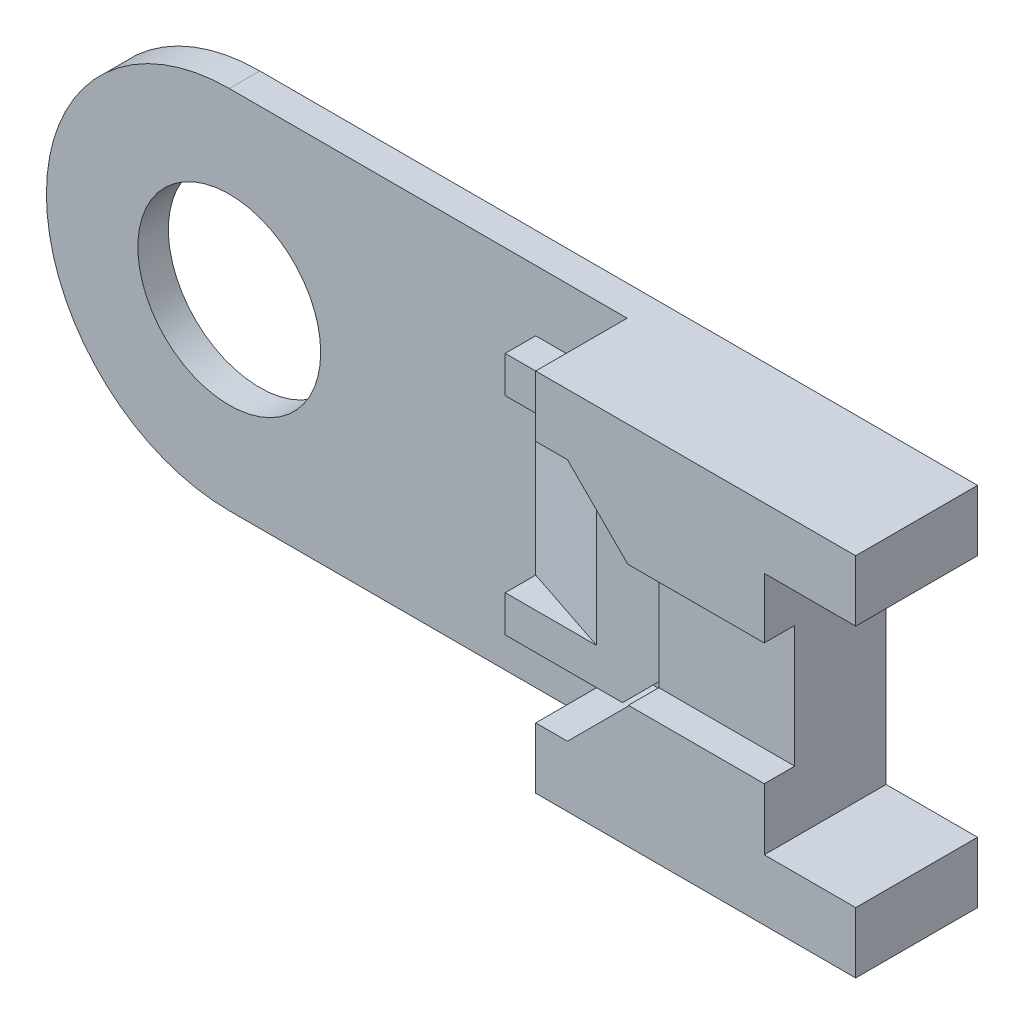
ISO-10303-21;
HEADER;
FILE_DESCRIPTION(('STEP AP214'),'2;1');
FILE_NAME('part.step','',(''),(''),'','','');
FILE_SCHEMA(('AUTOMOTIVE_DESIGN { 1 0 10303 214 1 1 1 1 }'));
ENDSEC;
DATA;
#1=APPLICATION_CONTEXT('core data for automotive mechanical design processes');
#2=APPLICATION_PROTOCOL_DEFINITION('international standard','automotive_design',2000,#1);
#3=PRODUCT_CONTEXT('',#1,'mechanical');
#4=PRODUCT('Part','Part','',(#3));
#5=PRODUCT_RELATED_PRODUCT_CATEGORY('part','',(#4));
#6=PRODUCT_DEFINITION_FORMATION('','',#4);
#7=PRODUCT_DEFINITION_CONTEXT('part definition',#1,'design');
#8=PRODUCT_DEFINITION('design','',#6,#7);
#9=PRODUCT_DEFINITION_SHAPE('','',#8);
#10=(LENGTH_UNIT() NAMED_UNIT(*) SI_UNIT(.MILLI.,.METRE.));
#11=(NAMED_UNIT(*) PLANE_ANGLE_UNIT() SI_UNIT($,.RADIAN.));
#12=(NAMED_UNIT(*) SI_UNIT($,.STERADIAN.) SOLID_ANGLE_UNIT());
#13=UNCERTAINTY_MEASURE_WITH_UNIT(LENGTH_MEASURE(1.E-05),#10,'distance_accuracy_value','');
#14=(GEOMETRIC_REPRESENTATION_CONTEXT(3) GLOBAL_UNCERTAINTY_ASSIGNED_CONTEXT((#13)) GLOBAL_UNIT_ASSIGNED_CONTEXT((#10,
#11,#12)) REPRESENTATION_CONTEXT('',''));
#15=CARTESIAN_POINT('',(0.,0.,0.));
#16=DIRECTION('',(0.,0.,1.));
#17=DIRECTION('',(1.,0.,0.));
#18=AXIS2_PLACEMENT_3D('',#15,#16,#17);
#19=CARTESIAN_POINT('',(46.2070441422371,20.,20.));
#20=DIRECTION('',(0.,1.,0.));
#21=DIRECTION('',(0.,0.,1.));
#22=AXIS2_PLACEMENT_3D('',#19,#20,#21);
#23=PLANE('',#22);
#24=DIRECTION('',(0.,0.,-1.));
#25=VECTOR('',#24,1.);
#26=CARTESIAN_POINT('',(46.2070441422371,20.,40.));
#27=LINE('',#26,#25);
#28=CARTESIAN_POINT('',(46.2070441422371,20.,20.));
#29=VERTEX_POINT('',#28);
#30=CARTESIAN_POINT('',(46.2070441422371,20.,10.));
#31=VERTEX_POINT('',#30);
#32=EDGE_CURVE('E367',#29,#31,#27,.T.);
#33=ORIENTED_EDGE('',*,*,#32,.F.);
#34=DIRECTION('',(-1.,0.,0.));
#35=VECTOR('',#34,1.);
#36=CARTESIAN_POINT('',(46.2070441422371,20.,20.));
#37=LINE('',#36,#35);
#38=CARTESIAN_POINT('',(16.2070441422371,20.,20.));
#39=VERTEX_POINT('',#38);
#40=EDGE_CURVE('E254',#29,#39,#37,.T.);
#41=ORIENTED_EDGE('',*,*,#40,.T.);
#42=DIRECTION('',(0.,0.,-1.));
#43=VECTOR('',#42,1.);
#44=CARTESIAN_POINT('',(16.2070441422371,20.,20.));
#45=LINE('',#44,#43);
#46=CARTESIAN_POINT('',(16.2070441422371,20.,10.));
#47=VERTEX_POINT('',#46);
#48=EDGE_CURVE('E235',#39,#47,#45,.T.);
#49=ORIENTED_EDGE('',*,*,#48,.T.);
#50=DIRECTION('',(1.,0.,0.));
#51=VECTOR('',#50,1.);
#52=CARTESIAN_POINT('',(46.2070441422371,20.,10.));
#53=LINE('',#52,#51);
#54=EDGE_CURVE('E301',#47,#31,#53,.T.);
#55=ORIENTED_EDGE('',*,*,#54,.T.);
#56=EDGE_LOOP('',(#33,#41,#49,#55));
#57=FACE_BOUND('',#56,.T.);
#58=ADVANCED_FACE('F39',(#57),#23,.F.);
#59=CARTESIAN_POINT('',(16.2070441422371,100.,20.));
#60=DIRECTION('',(1.,0.,0.));
#61=DIRECTION('',(0.,1.,0.));
#62=AXIS2_PLACEMENT_3D('',#59,#60,#61);
#63=PLANE('',#62);
#64=DIRECTION('',(0.,0.,-1.));
#65=VECTOR('',#64,1.);
#66=CARTESIAN_POINT('',(16.2070441422371,88.,20.));
#67=LINE('',#66,#65);
#68=CARTESIAN_POINT('',(16.2070441422371,88.,20.));
#69=VERTEX_POINT('',#68);
#70=CARTESIAN_POINT('',(16.2070441422371,88.,10.));
#71=VERTEX_POINT('',#70);
#72=EDGE_CURVE('E261',#69,#71,#67,.T.);
#73=ORIENTED_EDGE('',*,*,#72,.F.);
#74=DIRECTION('',(0.,-1.,0.));
#75=VECTOR('',#74,1.);
#76=CARTESIAN_POINT('',(16.2070441422371,100.,20.));
#77=LINE('',#76,#75);
#78=CARTESIAN_POINT('',(16.2070441422371,100.,20.));
#79=VERTEX_POINT('',#78);
#80=EDGE_CURVE('E276',#79,#69,#77,.T.);
#81=ORIENTED_EDGE('',*,*,#80,.F.);
#82=DIRECTION('',(0.,0.,-1.));
#83=VECTOR('',#82,1.);
#84=CARTESIAN_POINT('',(16.2070441422371,100.,20.));
#85=LINE('',#84,#83);
#86=CARTESIAN_POINT('',(16.2070441422371,100.,10.));
#87=VERTEX_POINT('',#86);
#88=EDGE_CURVE('E313',#79,#87,#85,.T.);
#89=ORIENTED_EDGE('',*,*,#88,.T.);
#90=DIRECTION('',(0.,-1.,0.));
#91=VECTOR('',#90,1.);
#92=CARTESIAN_POINT('',(16.2070441422371,100.,10.));
#93=LINE('',#92,#91);
#94=EDGE_CURVE('E297',#87,#71,#93,.T.);
#95=ORIENTED_EDGE('',*,*,#94,.T.);
#96=EDGE_LOOP('',(#73,#81,#89,#95));
#97=FACE_BOUND('',#96,.T.);
#98=ADVANCED_FACE('F554',(#97),#63,.F.);
#99=CARTESIAN_POINT('',(0.,0.,20.));
#100=DIRECTION('',(0.,0.,1.));
#101=DIRECTION('',(1.,0.,0.));
#102=AXIS2_PLACEMENT_3D('',#99,#100,#101);
#103=PLANE('',#102);
#104=DIRECTION('',(-1.,0.,0.));
#105=VECTOR('',#104,1.);
#106=CARTESIAN_POINT('',(46.2070441422371,88.,20.));
#107=LINE('',#106,#105);
#108=CARTESIAN_POINT('',(46.2070441422371,88.,20.));
#109=VERTEX_POINT('',#108);
#110=EDGE_CURVE('E241',#109,#69,#107,.T.);
#111=ORIENTED_EDGE('',*,*,#110,.F.);
#112=DIRECTION('',(0.,-1.,0.));
#113=VECTOR('',#112,1.);
#114=CARTESIAN_POINT('',(46.2070441422371,0.,20.));
#115=LINE('',#114,#113);
#116=CARTESIAN_POINT('',(46.2070441422371,32.,20.));
#117=VERTEX_POINT('',#116);
#118=EDGE_CURVE('E48',#109,#117,#115,.T.);
#119=ORIENTED_EDGE('',*,*,#118,.T.);
#120=DIRECTION('',(-1.,0.,0.));
#121=VECTOR('',#120,1.);
#122=CARTESIAN_POINT('',(46.2070441422371,32.,20.));
#123=LINE('',#122,#121);
#124=CARTESIAN_POINT('',(16.2070441422371,32.,20.));
#125=VERTEX_POINT('',#124);
#126=EDGE_CURVE('E246',#117,#125,#123,.T.);
#127=ORIENTED_EDGE('',*,*,#126,.T.);
#128=DIRECTION('',(0.,-1.,0.));
#129=VECTOR('',#128,1.);
#130=CARTESIAN_POINT('',(16.2070441422371,32.,20.));
#131=LINE('',#130,#129);
#132=EDGE_CURVE('E229',#125,#39,#131,.T.);
#133=ORIENTED_EDGE('',*,*,#132,.T.);
#134=ORIENTED_EDGE('',*,*,#40,.F.);
#135=DIRECTION('',(1.,0.,0.));
#136=VECTOR('',#135,1.);
#137=CARTESIAN_POINT('',(16.2070441422371,20.,20.));
#138=LINE('',#137,#136);
#139=CARTESIAN_POINT('',(54.6934302699853,20.,20.));
#140=VERTEX_POINT('',#139);
#141=EDGE_CURVE('E281',#29,#140,#138,.T.);
#142=ORIENTED_EDGE('',*,*,#141,.T.);
#143=DIRECTION('',(0.707106781186548,0.707106781186548,0.));
#144=VECTOR('',#143,1.);
#145=CARTESIAN_POINT('',(54.6934302699853,20.,20.));
#146=LINE('',#145,#144);
#147=CARTESIAN_POINT('',(76.6336353854819,41.9402051154966,20.));
#148=VERTEX_POINT('',#147);
#149=EDGE_CURVE('E284',#140,#148,#146,.T.);
#150=ORIENTED_EDGE('',*,*,#149,.T.);
#151=DIRECTION('',(0.,1.,0.));
#152=VECTOR('',#151,1.);
#153=CARTESIAN_POINT('',(76.6336353854819,41.9402051154966,20.));
#154=LINE('',#153,#152);
#155=CARTESIAN_POINT('',(76.6336353854819,80.,20.));
#156=VERTEX_POINT('',#155);
#157=EDGE_CURVE('E288',#148,#156,#154,.T.);
#158=ORIENTED_EDGE('',*,*,#157,.T.);
#159=DIRECTION('',(-0.707106781186547,0.707106781186548,0.));
#160=VECTOR('',#159,1.);
#161=CARTESIAN_POINT('',(76.6336353854819,80.,20.));
#162=LINE('',#161,#160);
#163=CARTESIAN_POINT('',(56.6336353854818,100.,20.));
#164=VERTEX_POINT('',#163);
#165=EDGE_CURVE('E291',#156,#164,#162,.T.);
#166=ORIENTED_EDGE('',*,*,#165,.T.);
#167=DIRECTION('',(-1.,0.,0.));
#168=VECTOR('',#167,1.);
#169=CARTESIAN_POINT('',(56.6336353854818,100.,20.));
#170=LINE('',#169,#168);
#171=CARTESIAN_POINT('',(46.2070441422371,100.,20.));
#172=VERTEX_POINT('',#171);
#173=EDGE_CURVE('E272',#164,#172,#170,.T.);
#174=ORIENTED_EDGE('',*,*,#173,.T.);
#175=EDGE_CURVE('E277',#172,#79,#170,.T.);
#176=ORIENTED_EDGE('',*,*,#175,.T.);
#177=ORIENTED_EDGE('',*,*,#80,.T.);
#178=EDGE_LOOP('',(#111,#119,#127,#133,#134,#142,#150,#158,#166,#174,#176,#177));
#179=FACE_BOUND('',#178,.T.);
#180=ADVANCED_FACE('F250',(#179),#103,.T.);
#181=CARTESIAN_POINT('',(-84.3434192007782,60.,10.));
#182=DIRECTION('',(0.,0.,1.));
#183=DIRECTION('',(1.,0.,0.));
#184=AXIS2_PLACEMENT_3D('',#181,#182,#183);
#185=PLANE('',#184);
#186=CARTESIAN_POINT('',(-84.3434192007782,60.,10.));
#187=DIRECTION('',(0.,0.,1.));
#188=DIRECTION('',(1.,0.,0.));
#189=AXIS2_PLACEMENT_3D('',#186,#187,#188);
#190=CIRCLE('',#189,30.);
#191=CARTESIAN_POINT('',(-54.3434192007782,60.,10.));
#192=VERTEX_POINT('',#191);
#193=EDGE_CURVE('E455',#192,#192,#190,.T.);
#194=ORIENTED_EDGE('',*,*,#193,.F.);
#195=EDGE_LOOP('',(#194));
#196=FACE_BOUND('',#195,.T.);
#197=ORIENTED_EDGE('',*,*,#94,.F.);
#198=DIRECTION('',(-1.,0.,0.));
#199=VECTOR('',#198,1.);
#200=CARTESIAN_POINT('',(46.2070441422371,100.,10.));
#201=LINE('',#200,#199);
#202=CARTESIAN_POINT('',(46.2070441422371,100.,10.));
#203=VERTEX_POINT('',#202);
#204=EDGE_CURVE('E271',#203,#87,#201,.T.);
#205=ORIENTED_EDGE('',*,*,#204,.F.);
#206=DIRECTION('',(0.,1.,0.));
#207=VECTOR('',#206,1.);
#208=CARTESIAN_POINT('',(46.2070441422371,60.,10.));
#209=LINE('',#208,#207);
#210=CARTESIAN_POINT('',(46.2070441422371,120.,10.));
#211=VERTEX_POINT('',#210);
#212=EDGE_CURVE('E449',#203,#211,#209,.T.);
#213=ORIENTED_EDGE('',*,*,#212,.T.);
#214=DIRECTION('',(-1.,0.,0.));
#215=VECTOR('',#214,1.);
#216=CARTESIAN_POINT('',(46.2070441422371,120.,10.));
#217=LINE('',#216,#215);
#218=CARTESIAN_POINT('',(-84.3434192007782,120.,10.));
#219=VERTEX_POINT('',#218);
#220=EDGE_CURVE('E467',#211,#219,#217,.T.);
#221=ORIENTED_EDGE('',*,*,#220,.T.);
#222=CARTESIAN_POINT('',(-84.3434192007782,60.,10.));
#223=DIRECTION('',(0.,0.,1.));
#224=DIRECTION('',(1.,0.,0.));
#225=AXIS2_PLACEMENT_3D('',#222,#223,#224);
#226=CIRCLE('',#225,60.);
#227=CARTESIAN_POINT('',(-84.3434192007782,0.,10.));
#228=VERTEX_POINT('',#227);
#229=EDGE_CURVE('E471',#219,#228,#226,.T.);
#230=ORIENTED_EDGE('',*,*,#229,.T.);
#231=DIRECTION('',(1.,0.,0.));
#232=VECTOR('',#231,1.);
#233=CARTESIAN_POINT('',(0.,0.,10.));
#234=LINE('',#233,#232);
#235=CARTESIAN_POINT('',(46.2070441422371,0.,10.));
#236=VERTEX_POINT('',#235);
#237=EDGE_CURVE('E463',#228,#236,#234,.T.);
#238=ORIENTED_EDGE('',*,*,#237,.T.);
#239=EDGE_CURVE('E450',#236,#31,#209,.T.);
#240=ORIENTED_EDGE('',*,*,#239,.T.);
#241=ORIENTED_EDGE('',*,*,#54,.F.);
#242=DIRECTION('',(0.,1.,0.));
#243=VECTOR('',#242,1.);
#244=CARTESIAN_POINT('',(16.2070441422371,19.,10.));
#245=LINE('',#244,#243);
#246=CARTESIAN_POINT('',(16.2070441422371,32.,10.));
#247=VERTEX_POINT('',#246);
#248=EDGE_CURVE('E268',#47,#247,#245,.T.);
#249=ORIENTED_EDGE('',*,*,#248,.T.);
#250=EDGE_CURVE('E55',#247,#71,#245,.T.);
#251=ORIENTED_EDGE('',*,*,#250,.T.);
#252=EDGE_LOOP('',(#197,#205,#213,#221,#230,#238,#240,#241,#249,#251));
#253=FACE_BOUND('',#252,.T.);
#254=ADVANCED_FACE('F546',(#196,#253),#185,.T.);
#255=DIRECTION('',(0.,1.,0.));
#256=VECTOR('',#255,1.);
#257=CARTESIAN_POINT('',(76.6336353854819,80.,10.));
#258=LINE('',#257,#256);
#259=CARTESIAN_POINT('',(76.6336353854819,40.,10.));
#260=VERTEX_POINT('',#259);
#261=CARTESIAN_POINT('',(76.6336353854819,41.9402051154966,10.));
#262=VERTEX_POINT('',#261);
#263=EDGE_CURVE('E326',#260,#262,#258,.T.);
#264=ORIENTED_EDGE('',*,*,#263,.T.);
#265=DIRECTION('',(0.707106781186548,0.707106781186548,0.));
#266=VECTOR('',#265,1.);
#267=CARTESIAN_POINT('',(54.6934302699853,20.,10.));
#268=LINE('',#267,#266);
#269=CARTESIAN_POINT('',(54.6934302699853,20.,10.));
#270=VERTEX_POINT('',#269);
#271=EDGE_CURVE('E304',#270,#262,#268,.T.);
#272=ORIENTED_EDGE('',*,*,#271,.F.);
#273=DIRECTION('',(1.,0.,0.));
#274=VECTOR('',#273,1.);
#275=CARTESIAN_POINT('',(19.5990862433128,20.,10.));
#276=LINE('',#275,#274);
#277=CARTESIAN_POINT('',(56.6336353854819,20.,10.));
#278=VERTEX_POINT('',#277);
#279=EDGE_CURVE('E318',#270,#278,#276,.T.);
#280=ORIENTED_EDGE('',*,*,#279,.T.);
#281=DIRECTION('',(0.707106781186548,0.707106781186548,0.));
#282=VECTOR('',#281,1.);
#283=CARTESIAN_POINT('',(56.6336353854819,20.,10.));
#284=LINE('',#283,#282);
#285=EDGE_CURVE('E321',#278,#260,#284,.T.);
#286=ORIENTED_EDGE('',*,*,#285,.T.);
#287=EDGE_LOOP('',(#264,#272,#280,#286));
#288=FACE_BOUND('',#287,.T.);
#289=ADVANCED_FACE('F595',(#288),#185,.T.);
#290=CARTESIAN_POINT('',(19.5990862433128,20.,10.));
#291=DIRECTION('',(0.,-1.,0.));
#292=DIRECTION('',(1.,0.,0.));
#293=AXIS2_PLACEMENT_3D('',#290,#291,#292);
#294=PLANE('',#293);
#295=DIRECTION('',(0.,0.,-1.));
#296=VECTOR('',#295,1.);
#297=CARTESIAN_POINT('',(54.6934302699853,20.,20.));
#298=LINE('',#297,#296);
#299=EDGE_CURVE('E310',#140,#270,#298,.T.);
#300=ORIENTED_EDGE('',*,*,#299,.F.);
#301=ORIENTED_EDGE('',*,*,#141,.F.);
#302=CARTESIAN_POINT('',(46.2070441422371,20.,40.));
#303=VERTEX_POINT('',#302);
#304=EDGE_CURVE('E368',#303,#29,#27,.T.);
#305=ORIENTED_EDGE('',*,*,#304,.F.);
#306=DIRECTION('',(1.,0.,0.));
#307=VECTOR('',#306,1.);
#308=CARTESIAN_POINT('',(19.5990862433128,20.,40.));
#309=LINE('',#308,#307);
#310=CARTESIAN_POINT('',(56.6336353854819,20.,40.));
#311=VERTEX_POINT('',#310);
#312=EDGE_CURVE('E317',#303,#311,#309,.T.);
#313=ORIENTED_EDGE('',*,*,#312,.T.);
#314=DIRECTION('',(0.,0.,1.));
#315=VECTOR('',#314,1.);
#316=CARTESIAN_POINT('',(56.6336353854819,20.,10.));
#317=LINE('',#316,#315);
#318=EDGE_CURVE('E330',#278,#311,#317,.T.);
#319=ORIENTED_EDGE('',*,*,#318,.F.);
#320=ORIENTED_EDGE('',*,*,#279,.F.);
#321=EDGE_LOOP('',(#300,#301,#305,#313,#319,#320));
#322=FACE_BOUND('',#321,.T.);
#323=ADVANCED_FACE('F591',(#322),#294,.F.);
#324=CARTESIAN_POINT('',(76.6336353854819,80.,10.));
#325=DIRECTION('',(1.,0.,0.));
#326=DIRECTION('',(0.,1.,0.));
#327=AXIS2_PLACEMENT_3D('',#324,#325,#326);
#328=PLANE('',#327);
#329=DIRECTION('',(0.,0.,-1.));
#330=VECTOR('',#329,1.);
#331=CARTESIAN_POINT('',(76.6336353854819,41.9402051154966,20.));
#332=LINE('',#331,#330);
#333=EDGE_CURVE('E294',#148,#262,#332,.T.);
#334=ORIENTED_EDGE('',*,*,#333,.T.);
#335=ORIENTED_EDGE('',*,*,#263,.F.);
#336=DIRECTION('',(0.,0.,1.));
#337=VECTOR('',#336,1.);
#338=CARTESIAN_POINT('',(76.6336353854819,40.,10.));
#339=LINE('',#338,#337);
#340=CARTESIAN_POINT('',(76.6336353854819,40.,40.));
#341=VERTEX_POINT('',#340);
#342=EDGE_CURVE('E354',#260,#341,#339,.T.);
#343=ORIENTED_EDGE('',*,*,#342,.T.);
#344=DIRECTION('',(0.,1.,0.));
#345=VECTOR('',#344,1.);
#346=CARTESIAN_POINT('',(76.6336353854819,80.,40.));
#347=LINE('',#346,#345);
#348=CARTESIAN_POINT('',(76.6336353854819,40.2090922157293,40.));
#349=VERTEX_POINT('',#348);
#350=EDGE_CURVE('E337',#341,#349,#347,.T.);
#351=ORIENTED_EDGE('',*,*,#350,.T.);
#352=DIRECTION('',(0.,0.,1.));
#353=VECTOR('',#352,1.);
#354=CARTESIAN_POINT('',(76.6336353854819,40.2090922157293,30.));
#355=LINE('',#354,#353);
#356=CARTESIAN_POINT('',(76.6336353854819,40.2090922157293,30.));
#357=VERTEX_POINT('',#356);
#358=EDGE_CURVE('E350',#357,#349,#355,.T.);
#359=ORIENTED_EDGE('',*,*,#358,.F.);
#360=DIRECTION('',(0.,-1.,0.));
#361=VECTOR('',#360,1.);
#362=CARTESIAN_POINT('',(76.6336353854819,0.,30.));
#363=LINE('',#362,#361);
#364=CARTESIAN_POINT('',(76.6336353854819,80.,30.));
#365=VERTEX_POINT('',#364);
#366=EDGE_CURVE('E526',#365,#357,#363,.T.);
#367=ORIENTED_EDGE('',*,*,#366,.F.);
#368=DIRECTION('',(0.,0.,1.));
#369=VECTOR('',#368,1.);
#370=CARTESIAN_POINT('',(76.6336353854819,80.,10.));
#371=LINE('',#370,#369);
#372=EDGE_CURVE('E351',#156,#365,#371,.T.);
#373=ORIENTED_EDGE('',*,*,#372,.F.);
#374=ORIENTED_EDGE('',*,*,#157,.F.);
#375=EDGE_LOOP('',(#334,#335,#343,#351,#359,#367,#373,#374));
#376=FACE_BOUND('',#375,.T.);
#377=ADVANCED_FACE('F598',(#376),#328,.F.);
#378=CARTESIAN_POINT('',(46.2070441422371,120.,40.));
#379=DIRECTION('',(1.,0.,0.));
#380=DIRECTION('',(0.,1.,0.));
#381=AXIS2_PLACEMENT_3D('',#378,#379,#380);
#382=PLANE('',#381);
#383=ORIENTED_EDGE('',*,*,#212,.F.);
#384=DIRECTION('',(0.,0.,1.));
#385=VECTOR('',#384,1.);
#386=CARTESIAN_POINT('',(46.2070441422371,100.,40.));
#387=LINE('',#386,#385);
#388=EDGE_CURVE('E372',#203,#172,#387,.T.);
#389=ORIENTED_EDGE('',*,*,#388,.T.);
#390=CARTESIAN_POINT('',(46.2070441422371,100.,40.));
#391=VERTEX_POINT('',#390);
#392=EDGE_CURVE('E371',#172,#391,#387,.T.);
#393=ORIENTED_EDGE('',*,*,#392,.T.);
#394=DIRECTION('',(0.,-1.,0.));
#395=VECTOR('',#394,1.);
#396=CARTESIAN_POINT('',(46.2070441422371,120.,40.));
#397=LINE('',#396,#395);
#398=CARTESIAN_POINT('',(46.2070441422371,120.,40.));
#399=VERTEX_POINT('',#398);
#400=EDGE_CURVE('E433',#399,#391,#397,.T.);
#401=ORIENTED_EDGE('',*,*,#400,.F.);
#402=DIRECTION('',(0.,0.,-1.));
#403=VECTOR('',#402,1.);
#404=CARTESIAN_POINT('',(46.2070441422371,120.,40.));
#405=LINE('',#404,#403);
#406=EDGE_CURVE('E445',#399,#211,#405,.T.);
#407=ORIENTED_EDGE('',*,*,#406,.T.);
#408=EDGE_LOOP('',(#383,#389,#393,#401,#407));
#409=FACE_BOUND('',#408,.T.);
#410=ADVANCED_FACE('F560',(#409),#382,.F.);
#411=CARTESIAN_POINT('',(0.,0.,40.));
#412=DIRECTION('',(0.,0.,-1.));
#413=DIRECTION('',(-1.,0.,0.));
#414=AXIS2_PLACEMENT_3D('',#411,#412,#413);
#415=PLANE('',#414);
#416=ORIENTED_EDGE('',*,*,#400,.T.);
#417=DIRECTION('',(-1.,0.,0.));
#418=VECTOR('',#417,1.);
#419=CARTESIAN_POINT('',(19.5990862433128,100.,40.));
#420=LINE('',#419,#418);
#421=CARTESIAN_POINT('',(56.6336353854819,100.,40.));
#422=VERTEX_POINT('',#421);
#423=EDGE_CURVE('E322',#422,#391,#420,.T.);
#424=ORIENTED_EDGE('',*,*,#423,.F.);
#425=DIRECTION('',(-0.707106781186547,0.707106781186548,0.));
#426=VECTOR('',#425,1.);
#427=CARTESIAN_POINT('',(56.6336353854819,100.,40.));
#428=LINE('',#427,#426);
#429=CARTESIAN_POINT('',(76.5427291982134,80.0909061872685,40.));
#430=VERTEX_POINT('',#429);
#431=EDGE_CURVE('E340',#430,#422,#428,.T.);
#432=ORIENTED_EDGE('',*,*,#431,.F.);
#433=DIRECTION('',(0.,-1.,0.));
#434=VECTOR('',#433,1.);
#435=CARTESIAN_POINT('',(76.5427291982134,80.2090922157293,40.));
#436=LINE('',#435,#434);
#437=CARTESIAN_POINT('',(76.5427291982134,80.2090922157293,40.));
#438=VERTEX_POINT('',#437);
#439=EDGE_CURVE('E391',#438,#430,#436,.T.);
#440=ORIENTED_EDGE('',*,*,#439,.F.);
#441=DIRECTION('',(-1.,0.,0.));
#442=VECTOR('',#441,1.);
#443=CARTESIAN_POINT('',(121.542729198213,80.2090922157293,40.));
#444=LINE('',#443,#442);
#445=CARTESIAN_POINT('',(121.207044142237,80.2090922157293,40.));
#446=VERTEX_POINT('',#445);
#447=EDGE_CURVE('E376',#446,#438,#444,.T.);
#448=ORIENTED_EDGE('',*,*,#447,.F.);
#449=DIRECTION('',(0.,-1.,0.));
#450=VECTOR('',#449,1.);
#451=CARTESIAN_POINT('',(121.207044142237,0.,40.));
#452=LINE('',#451,#450);
#453=CARTESIAN_POINT('',(121.207044142237,100.,40.));
#454=VERTEX_POINT('',#453);
#455=EDGE_CURVE('E504',#454,#446,#452,.T.);
#456=ORIENTED_EDGE('',*,*,#455,.F.);
#457=DIRECTION('',(1.,0.,0.));
#458=VECTOR('',#457,1.);
#459=CARTESIAN_POINT('',(0.,100.,40.));
#460=LINE('',#459,#458);
#461=CARTESIAN_POINT('',(151.207044142237,100.,40.));
#462=VERTEX_POINT('',#461);
#463=EDGE_CURVE('E512',#454,#462,#460,.T.);
#464=ORIENTED_EDGE('',*,*,#463,.T.);
#465=DIRECTION('',(0.,1.,0.));
#466=VECTOR('',#465,1.);
#467=CARTESIAN_POINT('',(151.207044142237,120.,40.));
#468=LINE('',#467,#466);
#469=CARTESIAN_POINT('',(151.207044142237,120.,40.));
#470=VERTEX_POINT('',#469);
#471=EDGE_CURVE('E424',#462,#470,#468,.T.);
#472=ORIENTED_EDGE('',*,*,#471,.T.);
#473=DIRECTION('',(-1.,0.,0.));
#474=VECTOR('',#473,1.);
#475=CARTESIAN_POINT('',(151.207044142237,120.,40.));
#476=LINE('',#475,#474);
#477=EDGE_CURVE('E429',#470,#399,#476,.T.);
#478=ORIENTED_EDGE('',*,*,#477,.T.);
#479=EDGE_LOOP('',(#416,#424,#432,#440,#448,#456,#464,#472,#478));
#480=FACE_BOUND('',#479,.T.);
#481=ADVANCED_FACE('F612',(#480),#415,.F.);
#482=CARTESIAN_POINT('',(151.207044142237,0.,10.));
#483=DIRECTION('',(-1.,0.,0.));
#484=DIRECTION('',(0.,0.,1.));
#485=AXIS2_PLACEMENT_3D('',#482,#483,#484);
#486=PLANE('',#485);
#487=ORIENTED_EDGE('',*,*,#471,.F.);
#488=DIRECTION('',(0.,0.,1.));
#489=VECTOR('',#488,1.);
#490=CARTESIAN_POINT('',(151.207044142237,100.,55.9858593321826));
#491=LINE('',#490,#489);
#492=CARTESIAN_POINT('',(151.207044142237,100.,0.));
#493=VERTEX_POINT('',#492);
#494=EDGE_CURVE('E406',#493,#462,#491,.T.);
#495=ORIENTED_EDGE('',*,*,#494,.F.);
#496=DIRECTION('',(0.,1.,0.));
#497=VECTOR('',#496,1.);
#498=CARTESIAN_POINT('',(151.207044142237,0.,0.));
#499=LINE('',#498,#497);
#500=CARTESIAN_POINT('',(151.207044142237,120.,0.));
#501=VERTEX_POINT('',#500);
#502=EDGE_CURVE('E477',#493,#501,#499,.T.);
#503=ORIENTED_EDGE('',*,*,#502,.T.);
#504=DIRECTION('',(0.,0.,-1.));
#505=VECTOR('',#504,1.);
#506=CARTESIAN_POINT('',(151.207044142237,120.,10.));
#507=LINE('',#506,#505);
#508=EDGE_CURVE('E495',#470,#501,#507,.T.);
#509=ORIENTED_EDGE('',*,*,#508,.F.);
#510=EDGE_LOOP('',(#487,#495,#503,#509));
#511=FACE_BOUND('',#510,.T.);
#512=ADVANCED_FACE('F617',(#511),#486,.F.);
#513=CARTESIAN_POINT('',(-84.3434192007782,60.,0.));
#514=DIRECTION('',(0.,0.,1.));
#515=DIRECTION('',(1.,0.,0.));
#516=AXIS2_PLACEMENT_3D('',#513,#514,#515);
#517=PLANE('',#516);
#518=ORIENTED_EDGE('',*,*,#502,.F.);
#519=DIRECTION('',(-1.,0.,0.));
#520=VECTOR('',#519,1.);
#521=CARTESIAN_POINT('',(-84.3434192007782,100.,0.));
#522=LINE('',#521,#520);
#523=CARTESIAN_POINT('',(121.207044142237,100.,0.));
#524=VERTEX_POINT('',#523);
#525=EDGE_CURVE('E420',#493,#524,#522,.T.);
#526=ORIENTED_EDGE('',*,*,#525,.T.);
#527=DIRECTION('',(0.,1.,0.));
#528=VECTOR('',#527,1.);
#529=CARTESIAN_POINT('',(121.207044142237,60.,0.));
#530=LINE('',#529,#528);
#531=CARTESIAN_POINT('',(121.207044142237,20.,0.));
#532=VERTEX_POINT('',#531);
#533=EDGE_CURVE('E409',#532,#524,#530,.T.);
#534=ORIENTED_EDGE('',*,*,#533,.F.);
#535=DIRECTION('',(1.,0.,0.));
#536=VECTOR('',#535,1.);
#537=CARTESIAN_POINT('',(-84.3434192007782,20.,0.));
#538=LINE('',#537,#536);
#539=CARTESIAN_POINT('',(151.207044142237,20.,0.));
#540=VERTEX_POINT('',#539);
#541=EDGE_CURVE('E416',#532,#540,#538,.T.);
#542=ORIENTED_EDGE('',*,*,#541,.T.);
#543=CARTESIAN_POINT('',(151.207044142237,0.,0.));
#544=VERTEX_POINT('',#543);
#545=EDGE_CURVE('E478',#544,#540,#499,.T.);
#546=ORIENTED_EDGE('',*,*,#545,.F.);
#547=DIRECTION('',(1.,0.,0.));
#548=VECTOR('',#547,1.);
#549=CARTESIAN_POINT('',(0.,0.,0.));
#550=LINE('',#549,#548);
#551=CARTESIAN_POINT('',(-84.3434192007782,0.,0.));
#552=VERTEX_POINT('',#551);
#553=EDGE_CURVE('E459',#552,#544,#550,.T.);
#554=ORIENTED_EDGE('',*,*,#553,.F.);
#555=CARTESIAN_POINT('',(-84.3434192007782,60.,0.));
#556=DIRECTION('',(0.,0.,1.));
#557=DIRECTION('',(1.,0.,0.));
#558=AXIS2_PLACEMENT_3D('',#555,#556,#557);
#559=CIRCLE('',#558,60.);
#560=CARTESIAN_POINT('',(-84.3434192007782,120.,0.));
#561=VERTEX_POINT('',#560);
#562=EDGE_CURVE('E468',#561,#552,#559,.T.);
#563=ORIENTED_EDGE('',*,*,#562,.F.);
#564=DIRECTION('',(-1.,0.,0.));
#565=VECTOR('',#564,1.);
#566=CARTESIAN_POINT('',(46.2070441422371,120.,0.));
#567=LINE('',#566,#565);
#568=EDGE_CURVE('E482',#501,#561,#567,.T.);
#569=ORIENTED_EDGE('',*,*,#568,.F.);
#570=EDGE_LOOP('',(#518,#526,#534,#542,#546,#554,#563,#569));
#571=FACE_BOUND('',#570,.T.);
#572=CARTESIAN_POINT('',(-84.3434192007782,60.,0.));
#573=DIRECTION('',(0.,0.,1.));
#574=DIRECTION('',(1.,0.,0.));
#575=AXIS2_PLACEMENT_3D('',#572,#573,#574);
#576=CIRCLE('',#575,30.);
#577=CARTESIAN_POINT('',(-54.3434192007782,60.,0.));
#578=VERTEX_POINT('',#577);
#579=EDGE_CURVE('E454',#578,#578,#576,.T.);
#580=ORIENTED_EDGE('',*,*,#579,.T.);
#581=EDGE_LOOP('',(#580));
#582=FACE_BOUND('',#581,.T.);
#583=ADVANCED_FACE('F621',(#571,#582),#517,.F.);
#584=CARTESIAN_POINT('',(0.,0.,10.));
#585=DIRECTION('',(0.,1.,0.));
#586=DIRECTION('',(0.,0.,1.));
#587=AXIS2_PLACEMENT_3D('',#584,#585,#586);
#588=PLANE('',#587);
#589=DIRECTION('',(0.,0.,-1.));
#590=VECTOR('',#589,1.);
#591=CARTESIAN_POINT('',(151.207044142237,0.,10.));
#592=LINE('',#591,#590);
#593=CARTESIAN_POINT('',(151.207044142237,0.,40.));
#594=VERTEX_POINT('',#593);
#595=EDGE_CURVE('E499',#594,#544,#592,.T.);
#596=ORIENTED_EDGE('',*,*,#595,.F.);
#597=DIRECTION('',(1.,0.,0.));
#598=VECTOR('',#597,1.);
#599=CARTESIAN_POINT('',(151.207044142237,0.,40.));
#600=LINE('',#599,#598);
#601=CARTESIAN_POINT('',(46.2070441422371,0.,40.));
#602=VERTEX_POINT('',#601);
#603=EDGE_CURVE('E437',#602,#594,#600,.T.);
#604=ORIENTED_EDGE('',*,*,#603,.F.);
#605=DIRECTION('',(0.,0.,-1.));
#606=VECTOR('',#605,1.);
#607=CARTESIAN_POINT('',(46.2070441422371,0.,40.));
#608=LINE('',#607,#606);
#609=EDGE_CURVE('E441',#602,#236,#608,.T.);
#610=ORIENTED_EDGE('',*,*,#609,.T.);
#611=ORIENTED_EDGE('',*,*,#237,.F.);
#612=DIRECTION('',(0.,0.,-1.));
#613=VECTOR('',#612,1.);
#614=CARTESIAN_POINT('',(-84.3434192007782,0.,10.));
#615=LINE('',#614,#613);
#616=EDGE_CURVE('E474',#228,#552,#615,.T.);
#617=ORIENTED_EDGE('',*,*,#616,.T.);
#618=ORIENTED_EDGE('',*,*,#553,.T.);
#619=EDGE_LOOP('',(#596,#604,#610,#611,#617,#618));
#620=FACE_BOUND('',#619,.T.);
#621=ADVANCED_FACE('F41',(#620),#588,.F.);
#622=ORIENTED_EDGE('',*,*,#545,.T.);
#623=DIRECTION('',(0.,0.,-1.));
#624=VECTOR('',#623,1.);
#625=CARTESIAN_POINT('',(151.207044142237,20.,55.9858593321826));
#626=LINE('',#625,#624);
#627=CARTESIAN_POINT('',(151.207044142237,20.,40.));
#628=VERTEX_POINT('',#627);
#629=EDGE_CURVE('E400',#628,#540,#626,.T.);
#630=ORIENTED_EDGE('',*,*,#629,.F.);
#631=EDGE_CURVE('E425',#594,#628,#468,.T.);
#632=ORIENTED_EDGE('',*,*,#631,.F.);
#633=ORIENTED_EDGE('',*,*,#595,.T.);
#634=EDGE_LOOP('',(#622,#630,#632,#633));
#635=FACE_BOUND('',#634,.T.);
#636=ADVANCED_FACE('F626',(#635),#486,.F.);
#637=CARTESIAN_POINT('',(46.2070441422371,120.,10.));
#638=DIRECTION('',(0.,-1.,0.));
#639=DIRECTION('',(1.,0.,0.));
#640=AXIS2_PLACEMENT_3D('',#637,#638,#639);
#641=PLANE('',#640);
#642=ORIENTED_EDGE('',*,*,#568,.T.);
#643=DIRECTION('',(0.,0.,-1.));
#644=VECTOR('',#643,1.);
#645=CARTESIAN_POINT('',(-84.3434192007782,120.,10.));
#646=LINE('',#645,#644);
#647=EDGE_CURVE('E491',#219,#561,#646,.T.);
#648=ORIENTED_EDGE('',*,*,#647,.F.);
#649=ORIENTED_EDGE('',*,*,#220,.F.);
#650=ORIENTED_EDGE('',*,*,#406,.F.);
#651=ORIENTED_EDGE('',*,*,#477,.F.);
#652=ORIENTED_EDGE('',*,*,#508,.T.);
#653=EDGE_LOOP('',(#642,#648,#649,#650,#651,#652));
#654=FACE_BOUND('',#653,.T.);
#655=ADVANCED_FACE('F567',(#654),#641,.F.);
#656=CARTESIAN_POINT('',(-84.3434192007782,60.,10.));
#657=DIRECTION('',(0.,0.,-1.));
#658=DIRECTION('',(-1.,0.,0.));
#659=AXIS2_PLACEMENT_3D('',#656,#657,#658);
#660=CYLINDRICAL_SURFACE('',#659,60.);
#661=ORIENTED_EDGE('',*,*,#562,.T.);
#662=ORIENTED_EDGE('',*,*,#616,.F.);
#663=ORIENTED_EDGE('',*,*,#229,.F.);
#664=ORIENTED_EDGE('',*,*,#647,.T.);
#665=EDGE_LOOP('',(#661,#662,#663,#664));
#666=FACE_BOUND('',#665,.T.);
#667=ADVANCED_FACE('F572',(#666),#660,.T.);
#668=CARTESIAN_POINT('',(-84.3434192007782,60.,10.));
#669=DIRECTION('',(0.,0.,-1.));
#670=DIRECTION('',(-1.,0.,0.));
#671=AXIS2_PLACEMENT_3D('',#668,#669,#670);
#672=CYLINDRICAL_SURFACE('',#671,30.);
#673=ORIENTED_EDGE('',*,*,#193,.T.);
#674=EDGE_LOOP('',(#673));
#675=FACE_BOUND('',#674,.T.);
#676=ORIENTED_EDGE('',*,*,#579,.F.);
#677=EDGE_LOOP('',(#676));
#678=FACE_BOUND('',#677,.T.);
#679=ADVANCED_FACE('F795',(#675,#678),#672,.F.);
#680=EDGE_CURVE('E432',#303,#602,#397,.T.);
#681=ORIENTED_EDGE('',*,*,#680,.F.);
#682=ORIENTED_EDGE('',*,*,#304,.T.);
#683=ORIENTED_EDGE('',*,*,#32,.T.);
#684=ORIENTED_EDGE('',*,*,#239,.F.);
#685=ORIENTED_EDGE('',*,*,#609,.F.);
#686=EDGE_LOOP('',(#681,#682,#683,#684,#685));
#687=FACE_BOUND('',#686,.T.);
#688=ADVANCED_FACE('F579',(#687),#382,.F.);
#689=DIRECTION('',(1.,0.,0.));
#690=VECTOR('',#689,1.);
#691=CARTESIAN_POINT('',(121.542729198213,40.2090922157293,40.));
#692=LINE('',#691,#690);
#693=CARTESIAN_POINT('',(121.207044142237,40.2090922157293,40.));
#694=VERTEX_POINT('',#693);
#695=EDGE_CURVE('E381',#349,#694,#692,.T.);
#696=ORIENTED_EDGE('',*,*,#695,.F.);
#697=ORIENTED_EDGE('',*,*,#350,.F.);
#698=DIRECTION('',(0.707106781186548,0.707106781186548,0.));
#699=VECTOR('',#698,1.);
#700=CARTESIAN_POINT('',(56.6336353854819,20.,40.));
#701=LINE('',#700,#699);
#702=EDGE_CURVE('E333',#311,#341,#701,.T.);
#703=ORIENTED_EDGE('',*,*,#702,.F.);
#704=ORIENTED_EDGE('',*,*,#312,.F.);
#705=ORIENTED_EDGE('',*,*,#680,.T.);
#706=ORIENTED_EDGE('',*,*,#603,.T.);
#707=ORIENTED_EDGE('',*,*,#631,.T.);
#708=DIRECTION('',(-1.,0.,0.));
#709=VECTOR('',#708,1.);
#710=CARTESIAN_POINT('',(0.,20.,40.));
#711=LINE('',#710,#709);
#712=CARTESIAN_POINT('',(121.207044142237,20.,40.));
#713=VERTEX_POINT('',#712);
#714=EDGE_CURVE('E508',#628,#713,#711,.T.);
#715=ORIENTED_EDGE('',*,*,#714,.T.);
#716=EDGE_CURVE('E503',#694,#713,#452,.T.);
#717=ORIENTED_EDGE('',*,*,#716,.F.);
#718=EDGE_LOOP('',(#696,#697,#703,#704,#705,#706,#707,#715,#717));
#719=FACE_BOUND('',#718,.T.);
#720=ADVANCED_FACE('F630',(#719),#415,.F.);
#721=CARTESIAN_POINT('',(121.207044142237,100.,55.9858593321826));
#722=DIRECTION('',(0.,1.,0.));
#723=DIRECTION('',(0.,0.,1.));
#724=AXIS2_PLACEMENT_3D('',#721,#722,#723);
#725=PLANE('',#724);
#726=ORIENTED_EDGE('',*,*,#494,.T.);
#727=ORIENTED_EDGE('',*,*,#463,.F.);
#728=DIRECTION('',(0.,0.,1.));
#729=VECTOR('',#728,1.);
#730=CARTESIAN_POINT('',(121.207044142237,100.,55.9858593321826));
#731=LINE('',#730,#729);
#732=EDGE_CURVE('E405',#524,#454,#731,.T.);
#733=ORIENTED_EDGE('',*,*,#732,.F.);
#734=ORIENTED_EDGE('',*,*,#525,.F.);
#735=EDGE_LOOP('',(#726,#727,#733,#734));
#736=FACE_BOUND('',#735,.T.);
#737=ADVANCED_FACE('F651',(#736),#725,.F.);
#738=CARTESIAN_POINT('',(121.207044142237,20.,55.9858593321826));
#739=DIRECTION('',(0.,-1.,0.));
#740=DIRECTION('',(0.,0.,-1.));
#741=AXIS2_PLACEMENT_3D('',#738,#739,#740);
#742=PLANE('',#741);
#743=DIRECTION('',(0.,0.,-1.));
#744=VECTOR('',#743,1.);
#745=CARTESIAN_POINT('',(121.207044142237,20.,55.9858593321826));
#746=LINE('',#745,#744);
#747=EDGE_CURVE('E401',#713,#532,#746,.T.);
#748=ORIENTED_EDGE('',*,*,#747,.F.);
#749=ORIENTED_EDGE('',*,*,#714,.F.);
#750=ORIENTED_EDGE('',*,*,#629,.T.);
#751=ORIENTED_EDGE('',*,*,#541,.F.);
#752=EDGE_LOOP('',(#748,#749,#750,#751));
#753=FACE_BOUND('',#752,.T.);
#754=ADVANCED_FACE('F647',(#753),#742,.F.);
#755=CARTESIAN_POINT('',(121.207044142237,0.,0.));
#756=DIRECTION('',(1.,0.,0.));
#757=DIRECTION('',(0.,0.,-1.));
#758=AXIS2_PLACEMENT_3D('',#755,#756,#757);
#759=PLANE('',#758);
#760=DIRECTION('',(0.,0.,-1.));
#761=VECTOR('',#760,1.);
#762=CARTESIAN_POINT('',(121.207044142237,40.2090922157293,0.));
#763=LINE('',#762,#761);
#764=CARTESIAN_POINT('',(121.207044142237,40.2090922157293,30.));
#765=VERTEX_POINT('',#764);
#766=EDGE_CURVE('E522',#694,#765,#763,.T.);
#767=ORIENTED_EDGE('',*,*,#766,.F.);
#768=ORIENTED_EDGE('',*,*,#716,.T.);
#769=ORIENTED_EDGE('',*,*,#747,.T.);
#770=ORIENTED_EDGE('',*,*,#533,.T.);
#771=ORIENTED_EDGE('',*,*,#732,.T.);
#772=ORIENTED_EDGE('',*,*,#455,.T.);
#773=DIRECTION('',(0.,0.,1.));
#774=VECTOR('',#773,1.);
#775=CARTESIAN_POINT('',(121.207044142237,80.2090922157293,0.));
#776=LINE('',#775,#774);
#777=CARTESIAN_POINT('',(121.207044142237,80.2090922157293,30.));
#778=VERTEX_POINT('',#777);
#779=EDGE_CURVE('E519',#778,#446,#776,.T.);
#780=ORIENTED_EDGE('',*,*,#779,.F.);
#781=DIRECTION('',(0.,1.,0.));
#782=VECTOR('',#781,1.);
#783=CARTESIAN_POINT('',(121.207044142237,0.,30.));
#784=LINE('',#783,#782);
#785=EDGE_CURVE('E516',#765,#778,#784,.T.);
#786=ORIENTED_EDGE('',*,*,#785,.F.);
#787=EDGE_LOOP('',(#767,#768,#769,#770,#771,#772,#780,#786));
#788=FACE_BOUND('',#787,.T.);
#789=ADVANCED_FACE('F643',(#788),#759,.T.);
#790=CARTESIAN_POINT('',(121.542729198213,40.2090922157293,30.));
#791=DIRECTION('',(0.,-1.,0.));
#792=DIRECTION('',(1.,0.,0.));
#793=AXIS2_PLACEMENT_3D('',#790,#791,#792);
#794=PLANE('',#793);
#795=DIRECTION('',(1.,0.,0.));
#796=VECTOR('',#795,1.);
#797=CARTESIAN_POINT('',(121.542729198213,40.2090922157293,30.));
#798=LINE('',#797,#796);
#799=EDGE_CURVE('E385',#357,#765,#798,.T.);
#800=ORIENTED_EDGE('',*,*,#799,.F.);
#801=ORIENTED_EDGE('',*,*,#358,.T.);
#802=ORIENTED_EDGE('',*,*,#695,.T.);
#803=ORIENTED_EDGE('',*,*,#766,.T.);
#804=EDGE_LOOP('',(#800,#801,#802,#803));
#805=FACE_BOUND('',#804,.T.);
#806=ADVANCED_FACE('F639',(#805),#794,.F.);
#807=CARTESIAN_POINT('',(76.5427291982134,80.2090922157293,30.));
#808=DIRECTION('',(-1.,0.,0.));
#809=DIRECTION('',(0.,-1.,0.));
#810=AXIS2_PLACEMENT_3D('',#807,#808,#809);
#811=PLANE('',#810);
#812=ORIENTED_EDGE('',*,*,#439,.T.);
#813=DIRECTION('',(0.,0.,-1.));
#814=VECTOR('',#813,1.);
#815=CARTESIAN_POINT('',(76.5427291982134,80.0909061872685,30.));
#816=LINE('',#815,#814);
#817=CARTESIAN_POINT('',(76.5427291982134,80.0909061872685,30.));
#818=VERTEX_POINT('',#817);
#819=EDGE_CURVE('E363',#430,#818,#816,.T.);
#820=ORIENTED_EDGE('',*,*,#819,.T.);
#821=DIRECTION('',(0.,-1.,0.));
#822=VECTOR('',#821,1.);
#823=CARTESIAN_POINT('',(76.5427291982134,80.2090922157293,30.));
#824=LINE('',#823,#822);
#825=CARTESIAN_POINT('',(76.5427291982134,80.2090922157293,30.));
#826=VERTEX_POINT('',#825);
#827=EDGE_CURVE('E380',#826,#818,#824,.T.);
#828=ORIENTED_EDGE('',*,*,#827,.F.);
#829=DIRECTION('',(0.,0.,1.));
#830=VECTOR('',#829,1.);
#831=CARTESIAN_POINT('',(76.5427291982134,80.2090922157293,30.));
#832=LINE('',#831,#830);
#833=EDGE_CURVE('E388',#826,#438,#832,.T.);
#834=ORIENTED_EDGE('',*,*,#833,.T.);
#835=EDGE_LOOP('',(#812,#820,#828,#834));
#836=FACE_BOUND('',#835,.T.);
#837=ADVANCED_FACE('F664',(#836),#811,.F.);
#838=CARTESIAN_POINT('',(121.542729198213,80.2090922157293,30.));
#839=DIRECTION('',(0.,1.,0.));
#840=DIRECTION('',(0.,0.,1.));
#841=AXIS2_PLACEMENT_3D('',#838,#839,#840);
#842=PLANE('',#841);
#843=ORIENTED_EDGE('',*,*,#779,.T.);
#844=ORIENTED_EDGE('',*,*,#447,.T.);
#845=ORIENTED_EDGE('',*,*,#833,.F.);
#846=DIRECTION('',(-1.,0.,0.));
#847=VECTOR('',#846,1.);
#848=CARTESIAN_POINT('',(121.542729198213,80.2090922157293,30.));
#849=LINE('',#848,#847);
#850=EDGE_CURVE('E377',#778,#826,#849,.T.);
#851=ORIENTED_EDGE('',*,*,#850,.F.);
#852=EDGE_LOOP('',(#843,#844,#845,#851));
#853=FACE_BOUND('',#852,.T.);
#854=ADVANCED_FACE('F658',(#853),#842,.F.);
#855=CARTESIAN_POINT('',(0.,0.,30.));
#856=DIRECTION('',(0.,0.,-1.));
#857=DIRECTION('',(-1.,0.,0.));
#858=AXIS2_PLACEMENT_3D('',#855,#856,#857);
#859=PLANE('',#858);
#860=ORIENTED_EDGE('',*,*,#827,.T.);
#861=DIRECTION('',(0.707106781186547,-0.707106781186548,0.));
#862=VECTOR('',#861,1.);
#863=CARTESIAN_POINT('',(78.3168176927409,78.3168176927409,30.));
#864=LINE('',#863,#862);
#865=EDGE_CURVE('E530',#818,#365,#864,.T.);
#866=ORIENTED_EDGE('',*,*,#865,.T.);
#867=ORIENTED_EDGE('',*,*,#366,.T.);
#868=ORIENTED_EDGE('',*,*,#799,.T.);
#869=ORIENTED_EDGE('',*,*,#785,.T.);
#870=ORIENTED_EDGE('',*,*,#850,.T.);
#871=EDGE_LOOP('',(#860,#866,#867,#868,#869,#870));
#872=FACE_BOUND('',#871,.T.);
#873=ADVANCED_FACE('F662',(#872),#859,.F.);
#874=CARTESIAN_POINT('',(19.5990862433128,100.,10.));
#875=DIRECTION('',(0.,1.,0.));
#876=DIRECTION('',(0.,0.,1.));
#877=AXIS2_PLACEMENT_3D('',#874,#875,#876);
#878=PLANE('',#877);
#879=ORIENTED_EDGE('',*,*,#392,.F.);
#880=ORIENTED_EDGE('',*,*,#173,.F.);
#881=DIRECTION('',(0.,0.,1.));
#882=VECTOR('',#881,1.);
#883=CARTESIAN_POINT('',(56.6336353854819,100.,10.));
#884=LINE('',#883,#882);
#885=EDGE_CURVE('E347',#164,#422,#884,.T.);
#886=ORIENTED_EDGE('',*,*,#885,.T.);
#887=ORIENTED_EDGE('',*,*,#423,.T.);
#888=EDGE_LOOP('',(#879,#880,#886,#887));
#889=FACE_BOUND('',#888,.T.);
#890=ADVANCED_FACE('F610',(#889),#878,.F.);
#891=CARTESIAN_POINT('',(56.6336353854819,100.,10.));
#892=DIRECTION('',(0.707106781186548,0.707106781186547,0.));
#893=DIRECTION('',(-0.707106781186547,0.707106781186548,0.));
#894=AXIS2_PLACEMENT_3D('',#891,#892,#893);
#895=PLANE('',#894);
#896=ORIENTED_EDGE('',*,*,#885,.F.);
#897=ORIENTED_EDGE('',*,*,#165,.F.);
#898=ORIENTED_EDGE('',*,*,#372,.T.);
#899=ORIENTED_EDGE('',*,*,#865,.F.);
#900=ORIENTED_EDGE('',*,*,#819,.F.);
#901=ORIENTED_EDGE('',*,*,#431,.T.);
#902=EDGE_LOOP('',(#896,#897,#898,#899,#900,#901));
#903=FACE_BOUND('',#902,.T.);
#904=ADVANCED_FACE('F605',(#903),#895,.F.);
#905=CARTESIAN_POINT('',(56.6336353854819,20.,10.));
#906=DIRECTION('',(0.707106781186547,-0.707106781186547,0.));
#907=DIRECTION('',(0.707106781186548,0.707106781186548,0.));
#908=AXIS2_PLACEMENT_3D('',#905,#906,#907);
#909=PLANE('',#908);
#910=ORIENTED_EDGE('',*,*,#702,.T.);
#911=ORIENTED_EDGE('',*,*,#342,.F.);
#912=ORIENTED_EDGE('',*,*,#285,.F.);
#913=ORIENTED_EDGE('',*,*,#318,.T.);
#914=EDGE_LOOP('',(#910,#911,#912,#913));
#915=FACE_BOUND('',#914,.T.);
#916=ADVANCED_FACE('F636',(#915),#909,.F.);
#917=CARTESIAN_POINT('',(46.2070441422371,100.,20.));
#918=DIRECTION('',(0.,-1.,0.));
#919=DIRECTION('',(0.,0.,-1.));
#920=AXIS2_PLACEMENT_3D('',#917,#918,#919);
#921=PLANE('',#920);
#922=ORIENTED_EDGE('',*,*,#175,.F.);
#923=ORIENTED_EDGE('',*,*,#388,.F.);
#924=ORIENTED_EDGE('',*,*,#204,.T.);
#925=ORIENTED_EDGE('',*,*,#88,.F.);
#926=EDGE_LOOP('',(#922,#923,#924,#925));
#927=FACE_BOUND('',#926,.T.);
#928=ADVANCED_FACE('F557',(#927),#921,.F.);
#929=CARTESIAN_POINT('',(54.6934302699853,20.,20.));
#930=DIRECTION('',(-0.707106781186548,0.707106781186548,0.));
#931=DIRECTION('',(-0.707106781186548,-0.707106781186548,0.));
#932=AXIS2_PLACEMENT_3D('',#929,#930,#931);
#933=PLANE('',#932);
#934=ORIENTED_EDGE('',*,*,#271,.T.);
#935=ORIENTED_EDGE('',*,*,#333,.F.);
#936=ORIENTED_EDGE('',*,*,#149,.F.);
#937=ORIENTED_EDGE('',*,*,#299,.T.);
#938=EDGE_LOOP('',(#934,#935,#936,#937));
#939=FACE_BOUND('',#938,.T.);
#940=ADVANCED_FACE('F588',(#939),#933,.F.);
#941=CARTESIAN_POINT('',(16.2070441422371,19.,10.));
#942=DIRECTION('',(-0.316227766016838,0.,0.948683298050514));
#943=DIRECTION('',(0.948683298050514,0.,0.316227766016838));
#944=AXIS2_PLACEMENT_3D('',#941,#942,#943);
#945=PLANE('',#944);
#946=DIRECTION('',(-0.948683298050514,0.,-0.316227766016838));
#947=VECTOR('',#946,1.);
#948=CARTESIAN_POINT('',(16.2070441422371,32.,10.));
#949=LINE('',#948,#947);
#950=EDGE_CURVE('E11',#117,#247,#949,.T.);
#951=ORIENTED_EDGE('',*,*,#950,.F.);
#952=ORIENTED_EDGE('',*,*,#118,.F.);
#953=DIRECTION('',(0.948683298050514,0.,0.316227766016838));
#954=VECTOR('',#953,1.);
#955=CARTESIAN_POINT('',(16.2070441422371,88.,10.));
#956=LINE('',#955,#954);
#957=EDGE_CURVE('E265',#71,#109,#956,.T.);
#958=ORIENTED_EDGE('',*,*,#957,.F.);
#959=ORIENTED_EDGE('',*,*,#250,.F.);
#960=EDGE_LOOP('',(#951,#952,#958,#959));
#961=FACE_BOUND('',#960,.T.);
#962=ADVANCED_FACE('F553',(#961),#945,.T.);
#963=CARTESIAN_POINT('',(0.,88.,0.));
#964=DIRECTION('',(0.,-1.,0.));
#965=DIRECTION('',(0.,0.,-1.));
#966=AXIS2_PLACEMENT_3D('',#963,#964,#965);
#967=PLANE('',#966);
#968=ORIENTED_EDGE('',*,*,#110,.T.);
#969=ORIENTED_EDGE('',*,*,#72,.T.);
#970=ORIENTED_EDGE('',*,*,#957,.T.);
#971=EDGE_LOOP('',(#968,#969,#970));
#972=FACE_BOUND('',#971,.T.);
#973=ADVANCED_FACE('F550',(#972),#967,.T.);
#974=CARTESIAN_POINT('',(16.2070441422371,32.,20.));
#975=DIRECTION('',(-1.,0.,0.));
#976=DIRECTION('',(0.,0.,1.));
#977=AXIS2_PLACEMENT_3D('',#974,#975,#976);
#978=PLANE('',#977);
#979=ORIENTED_EDGE('',*,*,#48,.F.);
#980=ORIENTED_EDGE('',*,*,#132,.F.);
#981=DIRECTION('',(0.,0.,-1.));
#982=VECTOR('',#981,1.);
#983=CARTESIAN_POINT('',(16.2070441422371,32.,20.));
#984=LINE('',#983,#982);
#985=EDGE_CURVE('E233',#125,#247,#984,.T.);
#986=ORIENTED_EDGE('',*,*,#985,.T.);
#987=ORIENTED_EDGE('',*,*,#248,.F.);
#988=EDGE_LOOP('',(#979,#980,#986,#987));
#989=FACE_BOUND('',#988,.T.);
#990=ADVANCED_FACE('F231',(#989),#978,.T.);
#991=CARTESIAN_POINT('',(0.,32.,0.));
#992=DIRECTION('',(0.,1.,0.));
#993=DIRECTION('',(0.,0.,1.));
#994=AXIS2_PLACEMENT_3D('',#991,#992,#993);
#995=PLANE('',#994);
#996=ORIENTED_EDGE('',*,*,#126,.F.);
#997=ORIENTED_EDGE('',*,*,#950,.T.);
#998=ORIENTED_EDGE('',*,*,#985,.F.);
#999=EDGE_LOOP('',(#996,#997,#998));
#1000=FACE_BOUND('',#999,.T.);
#1001=ADVANCED_FACE('F245',(#1000),#995,.T.);
#1002=CLOSED_SHELL('',(#58,#98,#180,#254,#289,#323,#377,#410,#481,#512,#583,#621,#636,#655,#667,
#679,#688,#720,#737,#754,#789,#806,#837,#854,#873,#890,#904,#916,#928,#940,#962,#973,#990,#1001));
#1003=MANIFOLD_SOLID_BREP('B2',#1002);
#1004=ADVANCED_BREP_SHAPE_REPRESENTATION('',(#18,#1003),#14);
#1005=SHAPE_DEFINITION_REPRESENTATION(#9,#1004);
ENDSEC;
END-ISO-10303-21;
